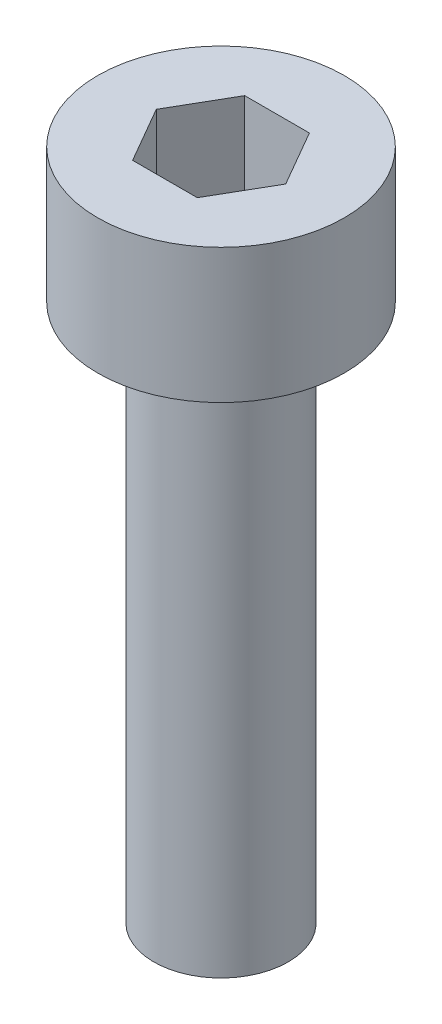
ISO-10303-21;
HEADER;
FILE_DESCRIPTION(('STEP AP214'),'2;1');
FILE_NAME('part.step','',(''),(''),'','','');
FILE_SCHEMA(('AUTOMOTIVE_DESIGN { 1 0 10303 214 1 1 1 1 }'));
ENDSEC;
DATA;
#1=APPLICATION_CONTEXT('core data for automotive mechanical design processes');
#2=APPLICATION_PROTOCOL_DEFINITION('international standard','automotive_design',2000,#1);
#3=PRODUCT_CONTEXT('',#1,'mechanical');
#4=PRODUCT('Part','Part','',(#3));
#5=PRODUCT_RELATED_PRODUCT_CATEGORY('part','',(#4));
#6=PRODUCT_DEFINITION_FORMATION('','',#4);
#7=PRODUCT_DEFINITION_CONTEXT('part definition',#1,'design');
#8=PRODUCT_DEFINITION('design','',#6,#7);
#9=PRODUCT_DEFINITION_SHAPE('','',#8);
#10=(LENGTH_UNIT() NAMED_UNIT(*) SI_UNIT(.MILLI.,.METRE.));
#11=(NAMED_UNIT(*) PLANE_ANGLE_UNIT() SI_UNIT($,.RADIAN.));
#12=(NAMED_UNIT(*) SI_UNIT($,.STERADIAN.) SOLID_ANGLE_UNIT());
#13=UNCERTAINTY_MEASURE_WITH_UNIT(LENGTH_MEASURE(1.E-05),#10,'distance_accuracy_value','');
#14=(GEOMETRIC_REPRESENTATION_CONTEXT(3) GLOBAL_UNCERTAINTY_ASSIGNED_CONTEXT((#13)) GLOBAL_UNIT_ASSIGNED_CONTEXT((#10,
#11,#12)) REPRESENTATION_CONTEXT('',''));
#15=CARTESIAN_POINT('',(0.,0.,0.));
#16=DIRECTION('',(0.,0.,1.));
#17=DIRECTION('',(1.,0.,0.));
#18=AXIS2_PLACEMENT_3D('',#15,#16,#17);
#19=CARTESIAN_POINT('',(0.,1.,0.));
#20=DIRECTION('',(0.,-1.,0.));
#21=DIRECTION('',(0.,0.,-1.));
#22=AXIS2_PLACEMENT_3D('',#19,#20,#21);
#23=PLANE('',#22);
#24=DIRECTION('',(0.50000000000019,0.,0.866025403784329));
#25=VECTOR('',#24,1.);
#26=CARTESIAN_POINT('',(0.7216875,1.,-1.249999417187));
#27=LINE('',#26,#25);
#28=CARTESIAN_POINT('',(0.7216875,1.,-1.249999417187));
#29=VERTEX_POINT('',#28);
#30=CARTESIAN_POINT('',(1.443375,1.,0.));
#31=VERTEX_POINT('',#30);
#32=EDGE_CURVE('E9',#29,#31,#27,.T.);
#33=ORIENTED_EDGE('',*,*,#32,.F.);
#34=DIRECTION('',(1.,0.,0.));
#35=VECTOR('',#34,1.);
#36=CARTESIAN_POINT('',(-0.7216875,1.,-1.249999417187));
#37=LINE('',#36,#35);
#38=CARTESIAN_POINT('',(-0.7216875,1.,-1.249999417187));
#39=VERTEX_POINT('',#38);
#40=EDGE_CURVE('E43',#39,#29,#37,.T.);
#41=ORIENTED_EDGE('',*,*,#40,.F.);
#42=DIRECTION('',(0.50000000000019,0.,-0.866025403784329));
#43=VECTOR('',#42,1.);
#44=CARTESIAN_POINT('',(-1.443375,1.,0.));
#45=LINE('',#44,#43);
#46=CARTESIAN_POINT('',(-1.443375,1.,0.));
#47=VERTEX_POINT('',#46);
#48=EDGE_CURVE('E99',#47,#39,#45,.T.);
#49=ORIENTED_EDGE('',*,*,#48,.F.);
#50=DIRECTION('',(-0.50000000000019,0.,-0.866025403784329));
#51=VECTOR('',#50,1.);
#52=CARTESIAN_POINT('',(-0.7216875,1.,1.249999417187));
#53=LINE('',#52,#51);
#54=CARTESIAN_POINT('',(-0.7216875,1.,1.249999417187));
#55=VERTEX_POINT('',#54);
#56=EDGE_CURVE('E93',#55,#47,#53,.T.);
#57=ORIENTED_EDGE('',*,*,#56,.F.);
#58=DIRECTION('',(-1.,0.,0.));
#59=VECTOR('',#58,1.);
#60=CARTESIAN_POINT('',(0.7216875,1.,1.249999417187));
#61=LINE('',#60,#59);
#62=CARTESIAN_POINT('',(0.7216875,1.,1.249999417187));
#63=VERTEX_POINT('',#62);
#64=EDGE_CURVE('E96',#63,#55,#61,.T.);
#65=ORIENTED_EDGE('',*,*,#64,.F.);
#66=DIRECTION('',(-0.50000000000019,0.,0.866025403784329));
#67=VECTOR('',#66,1.);
#68=CARTESIAN_POINT('',(1.443375,1.,0.));
#69=LINE('',#68,#67);
#70=EDGE_CURVE('E151',#31,#63,#69,.T.);
#71=ORIENTED_EDGE('',*,*,#70,.F.);
#72=EDGE_LOOP('',(#33,#41,#49,#57,#65,#71));
#73=FACE_BOUND('',#72,.T.);
#74=ADVANCED_FACE('F15',(#73),#23,.F.);
#75=CARTESIAN_POINT('',(0.,-12.,0.));
#76=DIRECTION('',(0.,-1.,0.));
#77=DIRECTION('',(0.,0.,-1.));
#78=AXIS2_PLACEMENT_3D('',#75,#76,#77);
#79=PLANE('',#78);
#80=CARTESIAN_POINT('',(0.,-12.,0.));
#81=DIRECTION('',(0.,-1.,0.));
#82=DIRECTION('',(1.,0.,0.));
#83=AXIS2_PLACEMENT_3D('',#80,#81,#82);
#84=CIRCLE('',#83,1.5);
#85=CARTESIAN_POINT('',(1.5,-12.,0.));
#86=VERTEX_POINT('',#85);
#87=EDGE_CURVE('E140',#86,#86,#84,.T.);
#88=ORIENTED_EDGE('',*,*,#87,.T.);
#89=EDGE_LOOP('',(#88));
#90=FACE_BOUND('',#89,.T.);
#91=ADVANCED_FACE('F188',(#90),#79,.T.);
#92=CARTESIAN_POINT('',(0.7216875,1.,-1.249999417187));
#93=DIRECTION('',(0.866025403784329,0.,-0.50000000000019));
#94=DIRECTION('',(0.,-1.,0.));
#95=AXIS2_PLACEMENT_3D('',#92,#93,#94);
#96=PLANE('',#95);
#97=ORIENTED_EDGE('',*,*,#32,.T.);
#98=DIRECTION('',(0.,1.,0.));
#99=VECTOR('',#98,1.);
#100=CARTESIAN_POINT('',(1.443375,1.,0.));
#101=LINE('',#100,#99);
#102=CARTESIAN_POINT('',(1.443375,3.,0.));
#103=VERTEX_POINT('',#102);
#104=EDGE_CURVE('E119',#31,#103,#101,.T.);
#105=ORIENTED_EDGE('',*,*,#104,.T.);
#106=DIRECTION('',(0.50000000000019,0.,0.866025403784329));
#107=VECTOR('',#106,1.);
#108=CARTESIAN_POINT('',(0.7216875,3.,-1.249999417187));
#109=LINE('',#108,#107);
#110=CARTESIAN_POINT('',(0.7216875,3.,-1.249999417187));
#111=VERTEX_POINT('',#110);
#112=EDGE_CURVE('E145',#111,#103,#109,.T.);
#113=ORIENTED_EDGE('',*,*,#112,.F.);
#114=DIRECTION('',(0.,1.,0.));
#115=VECTOR('',#114,1.);
#116=CARTESIAN_POINT('',(0.7216875,1.,-1.249999417187));
#117=LINE('',#116,#115);
#118=EDGE_CURVE('E23',#29,#111,#117,.T.);
#119=ORIENTED_EDGE('',*,*,#118,.F.);
#120=EDGE_LOOP('',(#97,#105,#113,#119));
#121=FACE_BOUND('',#120,.T.);
#122=ADVANCED_FACE('F168',(#121),#96,.F.);
#123=CARTESIAN_POINT('',(-0.7216875,1.,-1.249999417187));
#124=DIRECTION('',(0.,0.,-1.));
#125=DIRECTION('',(-1.,0.,0.));
#126=AXIS2_PLACEMENT_3D('',#123,#124,#125);
#127=PLANE('',#126);
#128=ORIENTED_EDGE('',*,*,#40,.T.);
#129=ORIENTED_EDGE('',*,*,#118,.T.);
#130=DIRECTION('',(1.,0.,0.));
#131=VECTOR('',#130,1.);
#132=CARTESIAN_POINT('',(-0.7216875,3.,-1.249999417187));
#133=LINE('',#132,#131);
#134=CARTESIAN_POINT('',(-0.7216875,3.,-1.249999417187));
#135=VERTEX_POINT('',#134);
#136=EDGE_CURVE('E135',#135,#111,#133,.T.);
#137=ORIENTED_EDGE('',*,*,#136,.F.);
#138=DIRECTION('',(0.,1.,0.));
#139=VECTOR('',#138,1.);
#140=CARTESIAN_POINT('',(-0.7216875,1.,-1.249999417187));
#141=LINE('',#140,#139);
#142=EDGE_CURVE('E130',#39,#135,#141,.T.);
#143=ORIENTED_EDGE('',*,*,#142,.F.);
#144=EDGE_LOOP('',(#128,#129,#137,#143));
#145=FACE_BOUND('',#144,.T.);
#146=ADVANCED_FACE('F165',(#145),#127,.F.);
#147=CARTESIAN_POINT('',(-1.443375,1.,0.));
#148=DIRECTION('',(-0.866025403784329,0.,-0.50000000000019));
#149=DIRECTION('',(-0.50000000000019,0.,0.866025403784329));
#150=AXIS2_PLACEMENT_3D('',#147,#148,#149);
#151=PLANE('',#150);
#152=ORIENTED_EDGE('',*,*,#48,.T.);
#153=ORIENTED_EDGE('',*,*,#142,.T.);
#154=DIRECTION('',(0.50000000000019,0.,-0.866025403784329));
#155=VECTOR('',#154,1.);
#156=CARTESIAN_POINT('',(-1.443375,3.,0.));
#157=LINE('',#156,#155);
#158=CARTESIAN_POINT('',(-1.443375,3.,0.));
#159=VERTEX_POINT('',#158);
#160=EDGE_CURVE('E131',#159,#135,#157,.T.);
#161=ORIENTED_EDGE('',*,*,#160,.F.);
#162=DIRECTION('',(0.,1.,0.));
#163=VECTOR('',#162,1.);
#164=CARTESIAN_POINT('',(-1.443375,1.,0.));
#165=LINE('',#164,#163);
#166=EDGE_CURVE('E103',#47,#159,#165,.T.);
#167=ORIENTED_EDGE('',*,*,#166,.F.);
#168=EDGE_LOOP('',(#152,#153,#161,#167));
#169=FACE_BOUND('',#168,.T.);
#170=ADVANCED_FACE('F177',(#169),#151,.F.);
#171=CARTESIAN_POINT('',(-0.7216875,1.,1.249999417187));
#172=DIRECTION('',(-0.866025403784329,0.,0.50000000000019));
#173=DIRECTION('',(0.,1.,0.));
#174=AXIS2_PLACEMENT_3D('',#171,#172,#173);
#175=PLANE('',#174);
#176=ORIENTED_EDGE('',*,*,#56,.T.);
#177=ORIENTED_EDGE('',*,*,#166,.T.);
#178=DIRECTION('',(-0.50000000000019,0.,-0.866025403784329));
#179=VECTOR('',#178,1.);
#180=CARTESIAN_POINT('',(-0.7216875,3.,1.249999417187));
#181=LINE('',#180,#179);
#182=CARTESIAN_POINT('',(-0.7216875,3.,1.249999417187));
#183=VERTEX_POINT('',#182);
#184=EDGE_CURVE('E109',#183,#159,#181,.T.);
#185=ORIENTED_EDGE('',*,*,#184,.F.);
#186=DIRECTION('',(0.,1.,0.));
#187=VECTOR('',#186,1.);
#188=CARTESIAN_POINT('',(-0.7216875,1.,1.249999417187));
#189=LINE('',#188,#187);
#190=EDGE_CURVE('E104',#55,#183,#189,.T.);
#191=ORIENTED_EDGE('',*,*,#190,.F.);
#192=EDGE_LOOP('',(#176,#177,#185,#191));
#193=FACE_BOUND('',#192,.T.);
#194=ADVANCED_FACE('F107',(#193),#175,.F.);
#195=CARTESIAN_POINT('',(0.7216875,1.,1.249999417187));
#196=DIRECTION('',(0.,0.,1.));
#197=DIRECTION('',(1.,0.,0.));
#198=AXIS2_PLACEMENT_3D('',#195,#196,#197);
#199=PLANE('',#198);
#200=ORIENTED_EDGE('',*,*,#64,.T.);
#201=ORIENTED_EDGE('',*,*,#190,.T.);
#202=DIRECTION('',(-1.,0.,0.));
#203=VECTOR('',#202,1.);
#204=CARTESIAN_POINT('',(0.7216875,3.,1.249999417187));
#205=LINE('',#204,#203);
#206=CARTESIAN_POINT('',(0.7216875,3.,1.249999417187));
#207=VERTEX_POINT('',#206);
#208=EDGE_CURVE('E205',#207,#183,#205,.T.);
#209=ORIENTED_EDGE('',*,*,#208,.F.);
#210=DIRECTION('',(0.,1.,0.));
#211=VECTOR('',#210,1.);
#212=CARTESIAN_POINT('',(0.7216875,1.,1.249999417187));
#213=LINE('',#212,#211);
#214=EDGE_CURVE('E116',#63,#207,#213,.T.);
#215=ORIENTED_EDGE('',*,*,#214,.F.);
#216=EDGE_LOOP('',(#200,#201,#209,#215));
#217=FACE_BOUND('',#216,.T.);
#218=ADVANCED_FACE('F115',(#217),#199,.F.);
#219=CARTESIAN_POINT('',(1.443375,1.,0.));
#220=DIRECTION('',(0.866025403784329,0.,0.50000000000019));
#221=DIRECTION('',(0.,-1.,0.));
#222=AXIS2_PLACEMENT_3D('',#219,#220,#221);
#223=PLANE('',#222);
#224=ORIENTED_EDGE('',*,*,#70,.T.);
#225=ORIENTED_EDGE('',*,*,#214,.T.);
#226=DIRECTION('',(-0.50000000000019,0.,0.866025403784329));
#227=VECTOR('',#226,1.);
#228=CARTESIAN_POINT('',(1.443375,3.,0.));
#229=LINE('',#228,#227);
#230=EDGE_CURVE('E141',#103,#207,#229,.T.);
#231=ORIENTED_EDGE('',*,*,#230,.F.);
#232=ORIENTED_EDGE('',*,*,#104,.F.);
#233=EDGE_LOOP('',(#224,#225,#231,#232));
#234=FACE_BOUND('',#233,.T.);
#235=ADVANCED_FACE('F224',(#234),#223,.F.);
#236=CARTESIAN_POINT('',(0.,0.,0.));
#237=DIRECTION('',(0.,1.,0.));
#238=DIRECTION('',(1.,0.,0.));
#239=AXIS2_PLACEMENT_3D('',#236,#237,#238);
#240=CYLINDRICAL_SURFACE('',#239,1.5);
#241=CARTESIAN_POINT('',(0.,0.,0.));
#242=DIRECTION('',(0.,-1.,0.));
#243=DIRECTION('',(1.,0.,0.));
#244=AXIS2_PLACEMENT_3D('',#241,#242,#243);
#245=CIRCLE('',#244,1.5);
#246=CARTESIAN_POINT('',(1.5,0.,0.));
#247=VERTEX_POINT('',#246);
#248=EDGE_CURVE('E202',#247,#247,#245,.T.);
#249=ORIENTED_EDGE('',*,*,#248,.T.);
#250=DIRECTION('',(0.,-1.,0.));
#251=VECTOR('',#250,1.);
#252=CARTESIAN_POINT('',(1.5,0.,0.));
#253=LINE('',#252,#251);
#254=EDGE_CURVE('E136',#247,#86,#253,.T.);
#255=ORIENTED_EDGE('',*,*,#254,.T.);
#256=ORIENTED_EDGE('',*,*,#87,.F.);
#257=ORIENTED_EDGE('',*,*,#254,.F.);
#258=EDGE_LOOP('',(#249,#255,#256,#257));
#259=FACE_BOUND('',#258,.T.);
#260=ADVANCED_FACE('F200',(#259),#240,.T.);
#261=CARTESIAN_POINT('',(0.,3.,0.));
#262=DIRECTION('',(0.,-1.,0.));
#263=DIRECTION('',(0.,0.,-1.));
#264=AXIS2_PLACEMENT_3D('',#261,#262,#263);
#265=PLANE('',#264);
#266=ORIENTED_EDGE('',*,*,#208,.T.);
#267=ORIENTED_EDGE('',*,*,#184,.T.);
#268=ORIENTED_EDGE('',*,*,#160,.T.);
#269=ORIENTED_EDGE('',*,*,#136,.T.);
#270=ORIENTED_EDGE('',*,*,#112,.T.);
#271=ORIENTED_EDGE('',*,*,#230,.T.);
#272=EDGE_LOOP('',(#266,#267,#268,#269,#270,#271));
#273=FACE_BOUND('',#272,.T.);
#274=CARTESIAN_POINT('',(0.,3.,0.));
#275=DIRECTION('',(0.,-1.,0.));
#276=DIRECTION('',(1.,0.,0.));
#277=AXIS2_PLACEMENT_3D('',#274,#275,#276);
#278=CIRCLE('',#277,2.75);
#279=CARTESIAN_POINT('',(2.75,3.,0.));
#280=VERTEX_POINT('',#279);
#281=EDGE_CURVE('E214',#280,#280,#278,.T.);
#282=ORIENTED_EDGE('',*,*,#281,.F.);
#283=EDGE_LOOP('',(#282));
#284=FACE_BOUND('',#283,.T.);
#285=ADVANCED_FACE('F173',(#273,#284),#265,.F.);
#286=CARTESIAN_POINT('',(0.,0.,0.));
#287=DIRECTION('',(0.,-1.,0.));
#288=DIRECTION('',(0.,0.,-1.));
#289=AXIS2_PLACEMENT_3D('',#286,#287,#288);
#290=PLANE('',#289);
#291=ORIENTED_EDGE('',*,*,#248,.F.);
#292=EDGE_LOOP('',(#291));
#293=FACE_BOUND('',#292,.T.);
#294=CARTESIAN_POINT('',(0.,0.,0.));
#295=DIRECTION('',(0.,-1.,0.));
#296=DIRECTION('',(1.,0.,0.));
#297=AXIS2_PLACEMENT_3D('',#294,#295,#296);
#298=CIRCLE('',#297,2.75);
#299=CARTESIAN_POINT('',(2.75,0.,0.));
#300=VERTEX_POINT('',#299);
#301=EDGE_CURVE('E206',#300,#300,#298,.T.);
#302=ORIENTED_EDGE('',*,*,#301,.T.);
#303=EDGE_LOOP('',(#302));
#304=FACE_BOUND('',#303,.T.);
#305=ADVANCED_FACE('F243',(#293,#304),#290,.T.);
#306=CARTESIAN_POINT('',(0.,0.,0.));
#307=DIRECTION('',(0.,-1.,0.));
#308=DIRECTION('',(1.,0.,0.));
#309=AXIS2_PLACEMENT_3D('',#306,#307,#308);
#310=CYLINDRICAL_SURFACE('',#309,2.75);
#311=DIRECTION('',(0.,1.,0.));
#312=VECTOR('',#311,1.);
#313=CARTESIAN_POINT('',(2.75,0.,0.));
#314=LINE('',#313,#312);
#315=EDGE_CURVE('E231',#300,#280,#314,.T.);
#316=ORIENTED_EDGE('',*,*,#315,.T.);
#317=ORIENTED_EDGE('',*,*,#281,.T.);
#318=ORIENTED_EDGE('',*,*,#315,.F.);
#319=ORIENTED_EDGE('',*,*,#301,.F.);
#320=EDGE_LOOP('',(#316,#317,#318,#319));
#321=FACE_BOUND('',#320,.T.);
#322=ADVANCED_FACE('F239',(#321),#310,.T.);
#323=CLOSED_SHELL('',(#74,#91,#122,#146,#170,#194,#218,#235,#260,#285,#305,#322));
#324=MANIFOLD_SOLID_BREP('B1',#323);
#325=ADVANCED_BREP_SHAPE_REPRESENTATION('',(#18,#324),#14);
#326=SHAPE_DEFINITION_REPRESENTATION(#9,#325);
ENDSEC;
END-ISO-10303-21;
